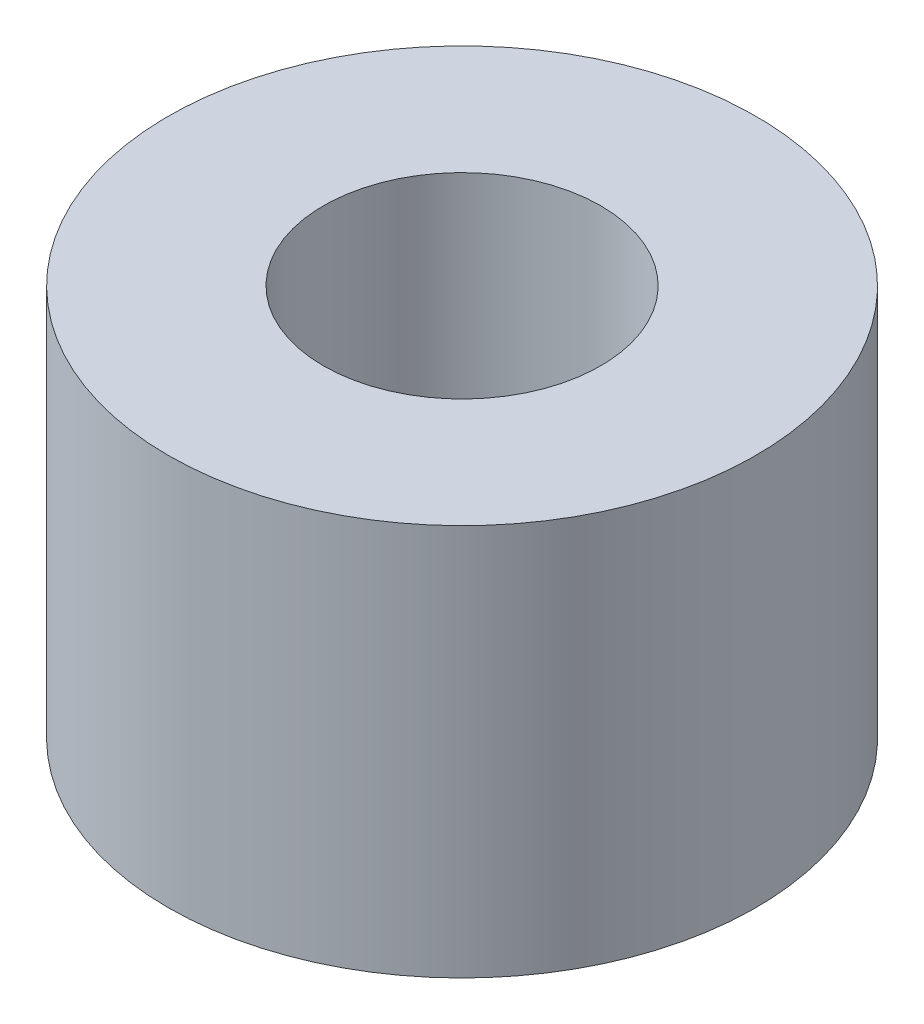
ISO-10303-21;
HEADER;
FILE_DESCRIPTION(('STEP AP214'),'2;1');
FILE_NAME('part.step','',(''),(''),'','','');
FILE_SCHEMA(('AUTOMOTIVE_DESIGN { 1 0 10303 214 1 1 1 1 }'));
ENDSEC;
DATA;
#1=APPLICATION_CONTEXT('core data for automotive mechanical design processes');
#2=APPLICATION_PROTOCOL_DEFINITION('international standard','automotive_design',2000,#1);
#3=PRODUCT_CONTEXT('',#1,'mechanical');
#4=PRODUCT('Part','Part','',(#3));
#5=PRODUCT_RELATED_PRODUCT_CATEGORY('part','',(#4));
#6=PRODUCT_DEFINITION_FORMATION('','',#4);
#7=PRODUCT_DEFINITION_CONTEXT('part definition',#1,'design');
#8=PRODUCT_DEFINITION('design','',#6,#7);
#9=PRODUCT_DEFINITION_SHAPE('','',#8);
#10=(LENGTH_UNIT() NAMED_UNIT(*) SI_UNIT(.MILLI.,.METRE.));
#11=(NAMED_UNIT(*) PLANE_ANGLE_UNIT() SI_UNIT($,.RADIAN.));
#12=(NAMED_UNIT(*) SI_UNIT($,.STERADIAN.) SOLID_ANGLE_UNIT());
#13=UNCERTAINTY_MEASURE_WITH_UNIT(LENGTH_MEASURE(1.E-05),#10,'distance_accuracy_value','');
#14=(GEOMETRIC_REPRESENTATION_CONTEXT(3) GLOBAL_UNCERTAINTY_ASSIGNED_CONTEXT((#13)) GLOBAL_UNIT_ASSIGNED_CONTEXT((#10,
#11,#12)) REPRESENTATION_CONTEXT('',''));
#15=CARTESIAN_POINT('',(0.,0.,0.));
#16=DIRECTION('',(0.,0.,1.));
#17=DIRECTION('',(1.,0.,0.));
#18=AXIS2_PLACEMENT_3D('',#15,#16,#17);
#19=CARTESIAN_POINT('',(0.,6.35,0.));
#20=DIRECTION('',(0.,-1.,0.));
#21=DIRECTION('',(0.,0.,-1.));
#22=AXIS2_PLACEMENT_3D('',#19,#20,#21);
#23=CYLINDRICAL_SURFACE('',#22,2.2479);
#24=CARTESIAN_POINT('',(0.,6.35,0.));
#25=DIRECTION('',(0.,1.,0.));
#26=DIRECTION('',(0.,0.,1.));
#27=AXIS2_PLACEMENT_3D('',#24,#25,#26);
#28=CIRCLE('',#27,2.2479);
#29=CARTESIAN_POINT('',(0.,6.35,2.2479));
#30=VERTEX_POINT('',#29);
#31=EDGE_CURVE('E46',#30,#30,#28,.T.);
#32=ORIENTED_EDGE('',*,*,#31,.T.);
#33=EDGE_LOOP('',(#32));
#34=FACE_BOUND('',#33,.T.);
#35=CARTESIAN_POINT('',(0.,0.,0.));
#36=DIRECTION('',(0.,1.,0.));
#37=DIRECTION('',(0.,0.,1.));
#38=AXIS2_PLACEMENT_3D('',#35,#36,#37);
#39=CIRCLE('',#38,2.2479);
#40=CARTESIAN_POINT('',(0.,0.,2.2479));
#41=VERTEX_POINT('',#40);
#42=EDGE_CURVE('E55',#41,#41,#39,.T.);
#43=ORIENTED_EDGE('',*,*,#42,.F.);
#44=EDGE_LOOP('',(#43));
#45=FACE_BOUND('',#44,.T.);
#46=ADVANCED_FACE('F39',(#34,#45),#23,.F.);
#47=CARTESIAN_POINT('',(0.,6.35,0.));
#48=DIRECTION('',(0.,-1.,0.));
#49=DIRECTION('',(0.,0.,-1.));
#50=AXIS2_PLACEMENT_3D('',#47,#48,#49);
#51=CYLINDRICAL_SURFACE('',#50,4.7625);
#52=CARTESIAN_POINT('',(0.,6.35,0.));
#53=DIRECTION('',(0.,1.,0.));
#54=DIRECTION('',(0.,0.,1.));
#55=AXIS2_PLACEMENT_3D('',#52,#53,#54);
#56=CIRCLE('',#55,4.7625);
#57=CARTESIAN_POINT('',(0.,6.35,4.7625));
#58=VERTEX_POINT('',#57);
#59=EDGE_CURVE('E10',#58,#58,#56,.T.);
#60=ORIENTED_EDGE('',*,*,#59,.F.);
#61=EDGE_LOOP('',(#60));
#62=FACE_BOUND('',#61,.T.);
#63=CARTESIAN_POINT('',(0.,0.,0.));
#64=DIRECTION('',(0.,1.,0.));
#65=DIRECTION('',(0.,0.,1.));
#66=AXIS2_PLACEMENT_3D('',#63,#64,#65);
#67=CIRCLE('',#66,4.7625);
#68=CARTESIAN_POINT('',(0.,0.,4.7625));
#69=VERTEX_POINT('',#68);
#70=EDGE_CURVE('E45',#69,#69,#67,.T.);
#71=ORIENTED_EDGE('',*,*,#70,.T.);
#72=EDGE_LOOP('',(#71));
#73=FACE_BOUND('',#72,.T.);
#74=ADVANCED_FACE('F56',(#62,#73),#51,.T.);
#75=CARTESIAN_POINT('',(0.,6.35,0.));
#76=DIRECTION('',(0.,1.,0.));
#77=DIRECTION('',(0.,0.,1.));
#78=AXIS2_PLACEMENT_3D('',#75,#76,#77);
#79=PLANE('',#78);
#80=ORIENTED_EDGE('',*,*,#31,.F.);
#81=EDGE_LOOP('',(#80));
#82=FACE_BOUND('',#81,.T.);
#83=ORIENTED_EDGE('',*,*,#59,.T.);
#84=EDGE_LOOP('',(#83));
#85=FACE_BOUND('',#84,.T.);
#86=ADVANCED_FACE('F64',(#82,#85),#79,.T.);
#87=CARTESIAN_POINT('',(0.,0.,0.));
#88=DIRECTION('',(0.,1.,0.));
#89=DIRECTION('',(0.,0.,1.));
#90=AXIS2_PLACEMENT_3D('',#87,#88,#89);
#91=PLANE('',#90);
#92=ORIENTED_EDGE('',*,*,#42,.T.);
#93=EDGE_LOOP('',(#92));
#94=FACE_BOUND('',#93,.T.);
#95=ORIENTED_EDGE('',*,*,#70,.F.);
#96=EDGE_LOOP('',(#95));
#97=FACE_BOUND('',#96,.T.);
#98=ADVANCED_FACE('F61',(#94,#97),#91,.F.);
#99=CLOSED_SHELL('',(#46,#74,#86,#98));
#100=MANIFOLD_SOLID_BREP('B2',#99);
#101=ADVANCED_BREP_SHAPE_REPRESENTATION('',(#18,#100),#14);
#102=SHAPE_DEFINITION_REPRESENTATION(#9,#101);
ENDSEC;
END-ISO-10303-21;
